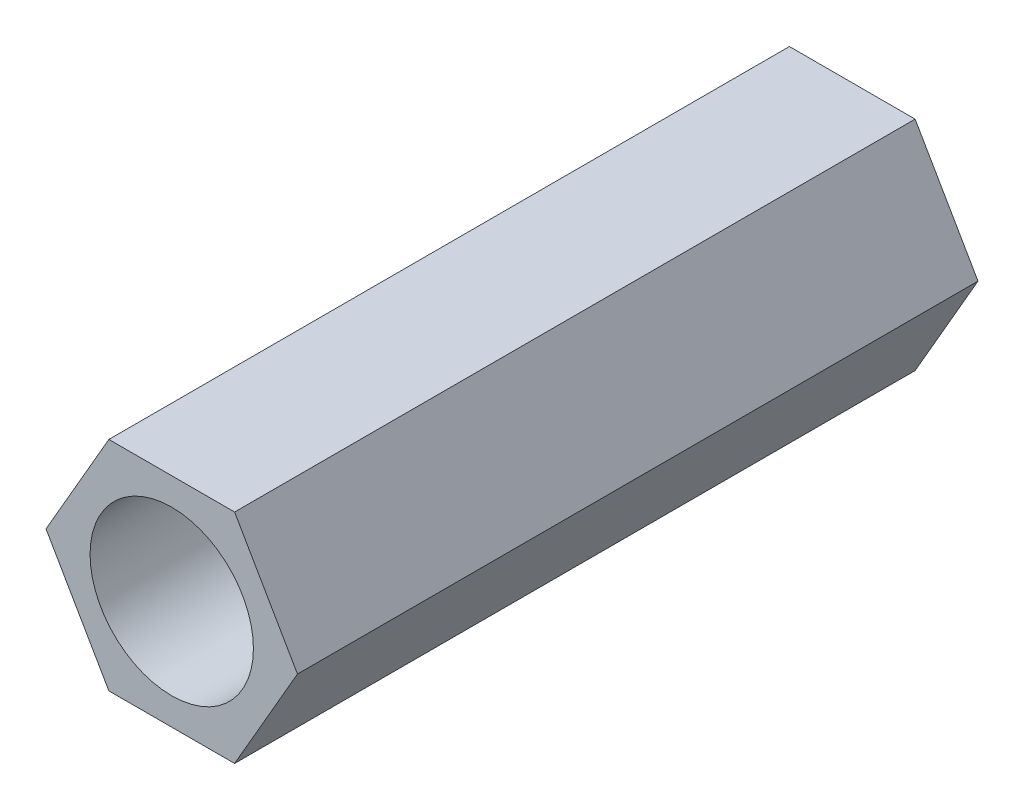
ISO-10303-21;
HEADER;
FILE_DESCRIPTION(('STEP AP214'),'2;1');
FILE_NAME('part.step','',(''),(''),'','','');
FILE_SCHEMA(('AUTOMOTIVE_DESIGN { 1 0 10303 214 1 1 1 1 }'));
ENDSEC;
DATA;
#1=APPLICATION_CONTEXT('core data for automotive mechanical design processes');
#2=APPLICATION_PROTOCOL_DEFINITION('international standard','automotive_design',2000,#1);
#3=PRODUCT_CONTEXT('',#1,'mechanical');
#4=PRODUCT('Part','Part','',(#3));
#5=PRODUCT_RELATED_PRODUCT_CATEGORY('part','',(#4));
#6=PRODUCT_DEFINITION_FORMATION('','',#4);
#7=PRODUCT_DEFINITION_CONTEXT('part definition',#1,'design');
#8=PRODUCT_DEFINITION('design','',#6,#7);
#9=PRODUCT_DEFINITION_SHAPE('','',#8);
#10=(LENGTH_UNIT() NAMED_UNIT(*) SI_UNIT(.MILLI.,.METRE.));
#11=(NAMED_UNIT(*) PLANE_ANGLE_UNIT() SI_UNIT($,.RADIAN.));
#12=(NAMED_UNIT(*) SI_UNIT($,.STERADIAN.) SOLID_ANGLE_UNIT());
#13=UNCERTAINTY_MEASURE_WITH_UNIT(LENGTH_MEASURE(1.E-05),#10,'distance_accuracy_value','');
#14=(GEOMETRIC_REPRESENTATION_CONTEXT(3) GLOBAL_UNCERTAINTY_ASSIGNED_CONTEXT((#13)) GLOBAL_UNIT_ASSIGNED_CONTEXT((#10,
#11,#12)) REPRESENTATION_CONTEXT('',''));
#15=CARTESIAN_POINT('',(0.,0.,0.));
#16=DIRECTION('',(0.,0.,1.));
#17=DIRECTION('',(1.,0.,0.));
#18=AXIS2_PLACEMENT_3D('',#15,#16,#17);
#19=CARTESIAN_POINT('',(0.,0.,12.5));
#20=DIRECTION('',(0.,0.,1.));
#21=DIRECTION('',(1.,0.,0.));
#22=AXIS2_PLACEMENT_3D('',#19,#20,#21);
#23=PLANE('',#22);
#24=DIRECTION('',(0.5,0.866025403784439,0.));
#25=VECTOR('',#24,1.);
#26=CARTESIAN_POINT('',(1.15470053837925,-2.,12.5));
#27=LINE('',#26,#25);
#28=CARTESIAN_POINT('',(1.15470053837925,-2.,12.5));
#29=VERTEX_POINT('',#28);
#30=CARTESIAN_POINT('',(2.3094010767585,0.,12.5));
#31=VERTEX_POINT('',#30);
#32=EDGE_CURVE('E156',#29,#31,#27,.T.);
#33=ORIENTED_EDGE('',*,*,#32,.T.);
#34=DIRECTION('',(-0.5,0.866025403784439,0.));
#35=VECTOR('',#34,1.);
#36=CARTESIAN_POINT('',(2.3094010767585,0.,12.5));
#37=LINE('',#36,#35);
#38=CARTESIAN_POINT('',(1.15470053837925,2.,12.5));
#39=VERTEX_POINT('',#38);
#40=EDGE_CURVE('E104',#31,#39,#37,.T.);
#41=ORIENTED_EDGE('',*,*,#40,.T.);
#42=DIRECTION('',(-1.,0.,0.));
#43=VECTOR('',#42,1.);
#44=CARTESIAN_POINT('',(1.15470053837925,2.,12.5));
#45=LINE('',#44,#43);
#46=CARTESIAN_POINT('',(-1.15470053837925,2.,12.5));
#47=VERTEX_POINT('',#46);
#48=EDGE_CURVE('E117',#39,#47,#45,.T.);
#49=ORIENTED_EDGE('',*,*,#48,.T.);
#50=DIRECTION('',(-0.5,-0.866025403784439,0.));
#51=VECTOR('',#50,1.);
#52=CARTESIAN_POINT('',(-1.15470053837925,2.,12.5));
#53=LINE('',#52,#51);
#54=CARTESIAN_POINT('',(-2.3094010767585,0.,12.5));
#55=VERTEX_POINT('',#54);
#56=EDGE_CURVE('E111',#47,#55,#53,.T.);
#57=ORIENTED_EDGE('',*,*,#56,.T.);
#58=DIRECTION('',(0.5,-0.866025403784438,0.));
#59=VECTOR('',#58,1.);
#60=CARTESIAN_POINT('',(-2.3094010767585,0.,12.5));
#61=LINE('',#60,#59);
#62=CARTESIAN_POINT('',(-1.15470053837925,-2.,12.5));
#63=VERTEX_POINT('',#62);
#64=EDGE_CURVE('E115',#55,#63,#61,.T.);
#65=ORIENTED_EDGE('',*,*,#64,.T.);
#66=DIRECTION('',(1.,0.,0.));
#67=VECTOR('',#66,1.);
#68=CARTESIAN_POINT('',(-1.15470053837925,-2.,12.5));
#69=LINE('',#68,#67);
#70=EDGE_CURVE('E67',#63,#29,#69,.T.);
#71=ORIENTED_EDGE('',*,*,#70,.T.);
#72=EDGE_LOOP('',(#33,#41,#49,#57,#65,#71));
#73=FACE_BOUND('',#72,.T.);
#74=CARTESIAN_POINT('',(0.,0.,12.5));
#75=DIRECTION('',(0.,0.,1.));
#76=DIRECTION('',(1.,0.,0.));
#77=AXIS2_PLACEMENT_3D('',#74,#75,#76);
#78=CIRCLE('',#77,1.5);
#79=CARTESIAN_POINT('',(1.5,0.,12.5));
#80=VERTEX_POINT('',#79);
#81=EDGE_CURVE('E144',#80,#80,#78,.T.);
#82=ORIENTED_EDGE('',*,*,#81,.F.);
#83=EDGE_LOOP('',(#82));
#84=FACE_BOUND('',#83,.T.);
#85=ADVANCED_FACE('F49',(#73,#84),#23,.T.);
#86=CARTESIAN_POINT('',(0.,0.,0.));
#87=DIRECTION('',(0.,0.,1.));
#88=DIRECTION('',(1.,0.,0.));
#89=AXIS2_PLACEMENT_3D('',#86,#87,#88);
#90=PLANE('',#89);
#91=DIRECTION('',(0.5,0.866025403784439,0.));
#92=VECTOR('',#91,1.);
#93=CARTESIAN_POINT('',(1.15470053837925,-2.,0.));
#94=LINE('',#93,#92);
#95=CARTESIAN_POINT('',(1.15470053837925,-2.,0.));
#96=VERTEX_POINT('',#95);
#97=CARTESIAN_POINT('',(2.3094010767585,0.,0.));
#98=VERTEX_POINT('',#97);
#99=EDGE_CURVE('E139',#96,#98,#94,.T.);
#100=ORIENTED_EDGE('',*,*,#99,.F.);
#101=DIRECTION('',(1.,0.,0.));
#102=VECTOR('',#101,1.);
#103=CARTESIAN_POINT('',(-1.15470053837925,-2.,0.));
#104=LINE('',#103,#102);
#105=CARTESIAN_POINT('',(-1.15470053837925,-2.,0.));
#106=VERTEX_POINT('',#105);
#107=EDGE_CURVE('E96',#106,#96,#104,.T.);
#108=ORIENTED_EDGE('',*,*,#107,.F.);
#109=DIRECTION('',(0.5,-0.866025403784438,0.));
#110=VECTOR('',#109,1.);
#111=CARTESIAN_POINT('',(-2.3094010767585,0.,0.));
#112=LINE('',#111,#110);
#113=CARTESIAN_POINT('',(-2.3094010767585,0.,0.));
#114=VERTEX_POINT('',#113);
#115=EDGE_CURVE('E90',#114,#106,#112,.T.);
#116=ORIENTED_EDGE('',*,*,#115,.F.);
#117=DIRECTION('',(-0.5,-0.866025403784439,0.));
#118=VECTOR('',#117,1.);
#119=CARTESIAN_POINT('',(-1.15470053837925,2.,0.));
#120=LINE('',#119,#118);
#121=CARTESIAN_POINT('',(-1.15470053837925,2.,0.));
#122=VERTEX_POINT('',#121);
#123=EDGE_CURVE('E126',#122,#114,#120,.T.);
#124=ORIENTED_EDGE('',*,*,#123,.F.);
#125=DIRECTION('',(-1.,0.,0.));
#126=VECTOR('',#125,1.);
#127=CARTESIAN_POINT('',(1.15470053837925,2.,0.));
#128=LINE('',#127,#126);
#129=CARTESIAN_POINT('',(1.15470053837925,2.,0.));
#130=VERTEX_POINT('',#129);
#131=EDGE_CURVE('E147',#130,#122,#128,.T.);
#132=ORIENTED_EDGE('',*,*,#131,.F.);
#133=DIRECTION('',(-0.5,0.866025403784439,0.));
#134=VECTOR('',#133,1.);
#135=CARTESIAN_POINT('',(2.3094010767585,0.,0.));
#136=LINE('',#135,#134);
#137=EDGE_CURVE('E143',#98,#130,#136,.T.);
#138=ORIENTED_EDGE('',*,*,#137,.F.);
#139=EDGE_LOOP('',(#100,#108,#116,#124,#132,#138));
#140=FACE_BOUND('',#139,.T.);
#141=CARTESIAN_POINT('',(0.,0.,0.));
#142=DIRECTION('',(0.,0.,1.));
#143=DIRECTION('',(1.,0.,0.));
#144=AXIS2_PLACEMENT_3D('',#141,#142,#143);
#145=CIRCLE('',#144,1.5);
#146=CARTESIAN_POINT('',(1.5,0.,0.));
#147=VERTEX_POINT('',#146);
#148=EDGE_CURVE('E289',#147,#147,#145,.T.);
#149=ORIENTED_EDGE('',*,*,#148,.T.);
#150=EDGE_LOOP('',(#149));
#151=FACE_BOUND('',#150,.T.);
#152=ADVANCED_FACE('F169',(#140,#151),#90,.F.);
#153=CARTESIAN_POINT('',(1.15470053837925,-2.,12.5));
#154=DIRECTION('',(-0.866025403784439,0.5,0.));
#155=DIRECTION('',(-0.5,-0.866025403784439,0.));
#156=AXIS2_PLACEMENT_3D('',#153,#154,#155);
#157=PLANE('',#156);
#158=ORIENTED_EDGE('',*,*,#99,.T.);
#159=DIRECTION('',(0.,0.,-1.));
#160=VECTOR('',#159,1.);
#161=CARTESIAN_POINT('',(2.3094010767585,0.,12.5));
#162=LINE('',#161,#160);
#163=EDGE_CURVE('E11',#31,#98,#162,.T.);
#164=ORIENTED_EDGE('',*,*,#163,.F.);
#165=ORIENTED_EDGE('',*,*,#32,.F.);
#166=DIRECTION('',(0.,0.,-1.));
#167=VECTOR('',#166,1.);
#168=CARTESIAN_POINT('',(1.15470053837925,-2.,12.5));
#169=LINE('',#168,#167);
#170=EDGE_CURVE('E135',#29,#96,#169,.T.);
#171=ORIENTED_EDGE('',*,*,#170,.T.);
#172=EDGE_LOOP('',(#158,#164,#165,#171));
#173=FACE_BOUND('',#172,.T.);
#174=ADVANCED_FACE('F51',(#173),#157,.F.);
#175=CARTESIAN_POINT('',(2.3094010767585,0.,12.5));
#176=DIRECTION('',(-0.866025403784439,-0.5,0.));
#177=DIRECTION('',(0.5,-0.866025403784439,0.));
#178=AXIS2_PLACEMENT_3D('',#175,#176,#177);
#179=PLANE('',#178);
#180=ORIENTED_EDGE('',*,*,#137,.T.);
#181=DIRECTION('',(0.,0.,-1.));
#182=VECTOR('',#181,1.);
#183=CARTESIAN_POINT('',(1.15470053837925,2.,12.5));
#184=LINE('',#183,#182);
#185=EDGE_CURVE('E59',#39,#130,#184,.T.);
#186=ORIENTED_EDGE('',*,*,#185,.F.);
#187=ORIENTED_EDGE('',*,*,#40,.F.);
#188=ORIENTED_EDGE('',*,*,#163,.T.);
#189=EDGE_LOOP('',(#180,#186,#187,#188));
#190=FACE_BOUND('',#189,.T.);
#191=ADVANCED_FACE('F194',(#190),#179,.F.);
#192=CARTESIAN_POINT('',(1.15470053837925,2.,12.5));
#193=DIRECTION('',(0.,-1.,0.));
#194=DIRECTION('',(0.,0.,-1.));
#195=AXIS2_PLACEMENT_3D('',#192,#193,#194);
#196=PLANE('',#195);
#197=ORIENTED_EDGE('',*,*,#131,.T.);
#198=DIRECTION('',(0.,0.,-1.));
#199=VECTOR('',#198,1.);
#200=CARTESIAN_POINT('',(-1.15470053837925,2.,12.5));
#201=LINE('',#200,#199);
#202=EDGE_CURVE('E128',#47,#122,#201,.T.);
#203=ORIENTED_EDGE('',*,*,#202,.F.);
#204=ORIENTED_EDGE('',*,*,#48,.F.);
#205=ORIENTED_EDGE('',*,*,#185,.T.);
#206=EDGE_LOOP('',(#197,#203,#204,#205));
#207=FACE_BOUND('',#206,.T.);
#208=ADVANCED_FACE('F166',(#207),#196,.F.);
#209=CARTESIAN_POINT('',(-1.15470053837925,2.,12.5));
#210=DIRECTION('',(0.866025403784439,-0.5,0.));
#211=DIRECTION('',(0.5,0.866025403784439,0.));
#212=AXIS2_PLACEMENT_3D('',#209,#210,#211);
#213=PLANE('',#212);
#214=ORIENTED_EDGE('',*,*,#123,.T.);
#215=DIRECTION('',(0.,0.,-1.));
#216=VECTOR('',#215,1.);
#217=CARTESIAN_POINT('',(-2.3094010767585,0.,12.5));
#218=LINE('',#217,#216);
#219=EDGE_CURVE('E123',#55,#114,#218,.T.);
#220=ORIENTED_EDGE('',*,*,#219,.F.);
#221=ORIENTED_EDGE('',*,*,#56,.F.);
#222=ORIENTED_EDGE('',*,*,#202,.T.);
#223=EDGE_LOOP('',(#214,#220,#221,#222));
#224=FACE_BOUND('',#223,.T.);
#225=ADVANCED_FACE('F124',(#224),#213,.F.);
#226=CARTESIAN_POINT('',(-2.3094010767585,0.,12.5));
#227=DIRECTION('',(0.866025403784438,0.5,0.));
#228=DIRECTION('',(-0.5,0.866025403784438,0.));
#229=AXIS2_PLACEMENT_3D('',#226,#227,#228);
#230=PLANE('',#229);
#231=ORIENTED_EDGE('',*,*,#115,.T.);
#232=DIRECTION('',(0.,0.,-1.));
#233=VECTOR('',#232,1.);
#234=CARTESIAN_POINT('',(-1.15470053837925,-2.,12.5));
#235=LINE('',#234,#233);
#236=EDGE_CURVE('E129',#63,#106,#235,.T.);
#237=ORIENTED_EDGE('',*,*,#236,.F.);
#238=ORIENTED_EDGE('',*,*,#64,.F.);
#239=ORIENTED_EDGE('',*,*,#219,.T.);
#240=EDGE_LOOP('',(#231,#237,#238,#239));
#241=FACE_BOUND('',#240,.T.);
#242=ADVANCED_FACE('F131',(#241),#230,.F.);
#243=CARTESIAN_POINT('',(-1.15470053837925,-2.,12.5));
#244=DIRECTION('',(0.,1.,0.));
#245=DIRECTION('',(0.,0.,1.));
#246=AXIS2_PLACEMENT_3D('',#243,#244,#245);
#247=PLANE('',#246);
#248=ORIENTED_EDGE('',*,*,#107,.T.);
#249=ORIENTED_EDGE('',*,*,#170,.F.);
#250=ORIENTED_EDGE('',*,*,#70,.F.);
#251=ORIENTED_EDGE('',*,*,#236,.T.);
#252=EDGE_LOOP('',(#248,#249,#250,#251));
#253=FACE_BOUND('',#252,.T.);
#254=ADVANCED_FACE('F174',(#253),#247,.F.);
#255=CARTESIAN_POINT('',(0.,0.,12.5));
#256=DIRECTION('',(0.,0.,-1.));
#257=DIRECTION('',(-1.,0.,0.));
#258=AXIS2_PLACEMENT_3D('',#255,#256,#257);
#259=CYLINDRICAL_SURFACE('',#258,1.5);
#260=ORIENTED_EDGE('',*,*,#81,.T.);
#261=EDGE_LOOP('',(#260));
#262=FACE_BOUND('',#261,.T.);
#263=ORIENTED_EDGE('',*,*,#148,.F.);
#264=EDGE_LOOP('',(#263));
#265=FACE_BOUND('',#264,.T.);
#266=ADVANCED_FACE('F176',(#262,#265),#259,.F.);
#267=CLOSED_SHELL('',(#85,#152,#174,#191,#208,#225,#242,#254,#266));
#268=MANIFOLD_SOLID_BREP('B2',#267);
#269=ADVANCED_BREP_SHAPE_REPRESENTATION('',(#18,#268),#14);
#270=SHAPE_DEFINITION_REPRESENTATION(#9,#269);
ENDSEC;
END-ISO-10303-21;
